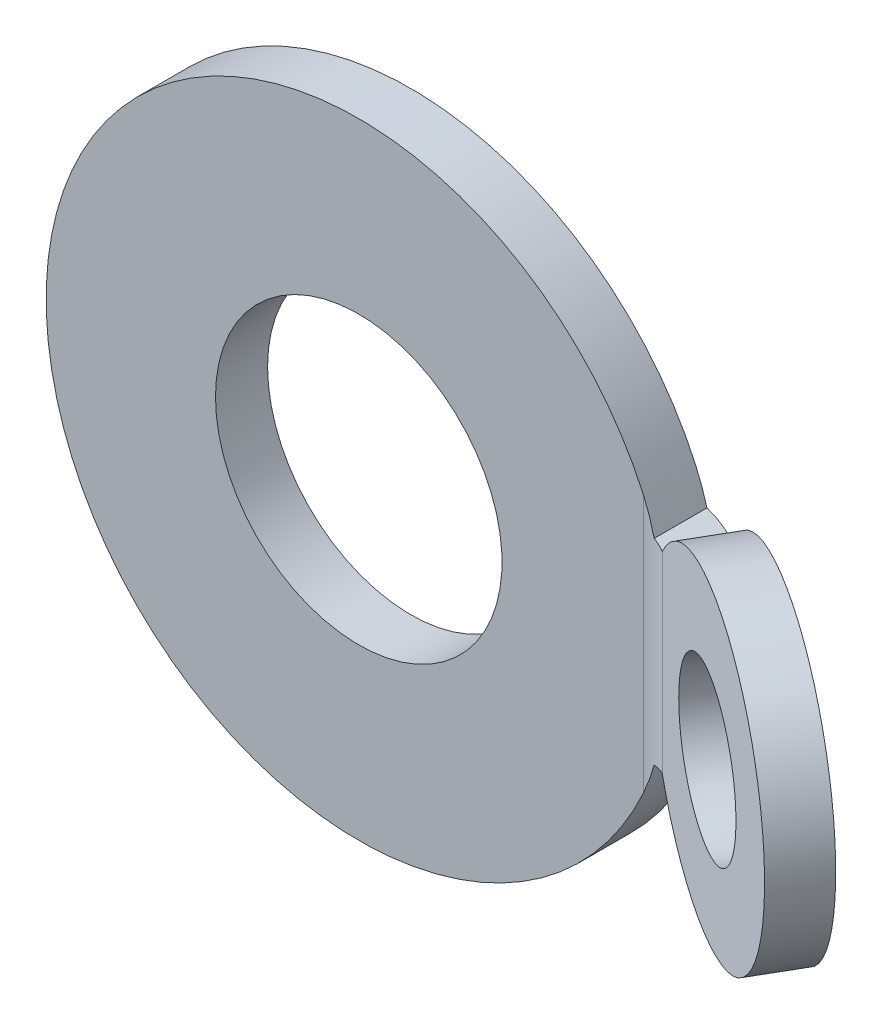
ISO-10303-21;
HEADER;
FILE_DESCRIPTION(('STEP AP214'),'2;1');
FILE_NAME('part.step','',(''),(''),'','','');
FILE_SCHEMA(('AUTOMOTIVE_DESIGN { 1 0 10303 214 1 1 1 1 }'));
ENDSEC;
DATA;
#1=APPLICATION_CONTEXT('core data for automotive mechanical design processes');
#2=APPLICATION_PROTOCOL_DEFINITION('international standard','automotive_design',2000,#1);
#3=PRODUCT_CONTEXT('',#1,'mechanical');
#4=PRODUCT('Part','Part','',(#3));
#5=PRODUCT_RELATED_PRODUCT_CATEGORY('part','',(#4));
#6=PRODUCT_DEFINITION_FORMATION('','',#4);
#7=PRODUCT_DEFINITION_CONTEXT('part definition',#1,'design');
#8=PRODUCT_DEFINITION('design','',#6,#7);
#9=PRODUCT_DEFINITION_SHAPE('','',#8);
#10=(LENGTH_UNIT() NAMED_UNIT(*) SI_UNIT(.MILLI.,.METRE.));
#11=(NAMED_UNIT(*) PLANE_ANGLE_UNIT() SI_UNIT($,.RADIAN.));
#12=(NAMED_UNIT(*) SI_UNIT($,.STERADIAN.) SOLID_ANGLE_UNIT());
#13=UNCERTAINTY_MEASURE_WITH_UNIT(LENGTH_MEASURE(1.E-05),#10,'distance_accuracy_value','');
#14=(GEOMETRIC_REPRESENTATION_CONTEXT(3) GLOBAL_UNCERTAINTY_ASSIGNED_CONTEXT((#13)) GLOBAL_UNIT_ASSIGNED_CONTEXT((#10,
#11,#12)) REPRESENTATION_CONTEXT('',''));
#15=CARTESIAN_POINT('',(0.,0.,0.));
#16=DIRECTION('',(0.,0.,1.));
#17=DIRECTION('',(1.,0.,0.));
#18=AXIS2_PLACEMENT_3D('',#15,#16,#17);
#19=CARTESIAN_POINT('',(-2.40192378864668,-6.,0.633974596215568));
#20=DIRECTION('',(-0.5,0.,0.866025403784439));
#21=DIRECTION('',(0.866025403784439,0.,0.5));
#22=AXIS2_PLACEMENT_3D('',#19,#20,#21);
#23=PLANE('',#22);
#24=DIRECTION('',(0.,-1.,0.));
#25=VECTOR('',#24,1.);
#26=CARTESIAN_POINT('',(-7.03589838486224,-6.,-2.04145188432737));
#27=LINE('',#26,#25);
#28=CARTESIAN_POINT('',(-7.03589838486224,1.86373022601282,-2.04145188432737));
#29=VERTEX_POINT('',#28);
#30=CARTESIAN_POINT('',(-7.03589838486224,-1.86373022601282,-2.04145188432737));
#31=VERTEX_POINT('',#30);
#32=EDGE_CURVE('E111',#29,#31,#27,.T.);
#33=ORIENTED_EDGE('',*,*,#32,.F.);
#34=CARTESIAN_POINT('',(-5.,0.,-0.866025403784431));
#35=DIRECTION('',(0.5,0.,-0.866025403784439));
#36=DIRECTION('',(-0.866025403784439,0.,-0.5));
#37=AXIS2_PLACEMENT_3D('',#34,#35,#36);
#38=CIRCLE('',#37,3.);
#39=EDGE_CURVE('E373',#31,#29,#38,.F.);
#40=ORIENTED_EDGE('',*,*,#39,.F.);
#41=EDGE_LOOP('',(#33,#40));
#42=FACE_BOUND('',#41,.T.);
#43=CARTESIAN_POINT('',(-5.,0.,-0.866025403784431));
#44=DIRECTION('',(0.5,0.,-0.866025403784439));
#45=DIRECTION('',(-0.866025403784439,0.,-0.5));
#46=AXIS2_PLACEMENT_3D('',#43,#44,#45);
#47=CIRCLE('',#46,1.5);
#48=CARTESIAN_POINT('',(-6.29903810567666,0.,-1.61602540378443));
#49=VERTEX_POINT('',#48);
#50=EDGE_CURVE('E20',#49,#49,#47,.F.);
#51=ORIENTED_EDGE('',*,*,#50,.T.);
#52=EDGE_LOOP('',(#51));
#53=FACE_BOUND('',#52,.T.);
#54=ADVANCED_FACE('F17',(#42,#53),#23,.F.);
#55=CARTESIAN_POINT('',(-5.25,0.,-0.433012701892215));
#56=DIRECTION('',(0.5,0.,-0.866025403784439));
#57=DIRECTION('',(-0.866025403784439,0.,-0.5));
#58=AXIS2_PLACEMENT_3D('',#55,#56,#57);
#59=CYLINDRICAL_SURFACE('',#58,1.5);
#60=ORIENTED_EDGE('',*,*,#50,.F.);
#61=EDGE_LOOP('',(#60));
#62=FACE_BOUND('',#61,.T.);
#63=CARTESIAN_POINT('',(-5.5,0.,0.));
#64=DIRECTION('',(0.5,0.,-0.866025403784439));
#65=DIRECTION('',(-0.866025403784439,0.,-0.5));
#66=AXIS2_PLACEMENT_3D('',#63,#64,#65);
#67=CIRCLE('',#66,1.5);
#68=CARTESIAN_POINT('',(-6.79903810567666,0.,-0.749999999999996));
#69=VERTEX_POINT('',#68);
#70=EDGE_CURVE('E89',#69,#69,#67,.F.);
#71=ORIENTED_EDGE('',*,*,#70,.T.);
#72=EDGE_LOOP('',(#71));
#73=FACE_BOUND('',#72,.T.);
#74=ADVANCED_FACE('F244',(#62,#73),#59,.F.);
#75=CARTESIAN_POINT('',(-5.25,0.,-0.433012701892213));
#76=DIRECTION('',(0.5,0.,-0.866025403784439));
#77=DIRECTION('',(-0.866025403784439,0.,-0.5));
#78=AXIS2_PLACEMENT_3D('',#75,#76,#77);
#79=CYLINDRICAL_SURFACE('',#78,3.);
#80=CARTESIAN_POINT('',(-7.55009449027577,1.84296335807702,-1.18346890936911));
#81=CARTESIAN_POINT('',(-7.54773069545789,1.84643638423818,-1.18215526106405));
#82=CARTESIAN_POINT('',(-7.54536578926449,1.84990346964674,-1.18082823450933));
#83=CARTESIAN_POINT('',(-7.54063375412665,1.85682575895867,-1.17814742490061));
#84=CARTESIAN_POINT('',(-7.53826662518221,1.86028096286203,-1.1767936418466));
#85=CARTESIAN_POINT('',(-7.53589838486225,1.8637302260128,-1.17542648054294));
#86=B_SPLINE_CURVE_WITH_KNOTS('',3,(#80,#81,#82,#83,#84,#85),.UNSPECIFIED.,.F.,.F.,(4,2,4),(0.,
0.0132049293105582,0.0264098586211165),.UNSPECIFIED.);
#87=CARTESIAN_POINT('',(-7.55009448063647,1.84296337224009,-1.18346890401152));
#88=VERTEX_POINT('',#87);
#89=CARTESIAN_POINT('',(-7.53589838486225,1.8637302260128,-1.17542648054294));
#90=VERTEX_POINT('',#89);
#91=EDGE_CURVE('E84',#88,#90,#86,.T.);
#92=ORIENTED_EDGE('',*,*,#91,.T.);
#93=CARTESIAN_POINT('',(-5.5,0.,0.));
#94=DIRECTION('',(0.5,0.,-0.866025403784439));
#95=DIRECTION('',(-0.866025403784439,0.,-0.5));
#96=AXIS2_PLACEMENT_3D('',#93,#94,#95);
#97=CIRCLE('',#96,3.);
#98=CARTESIAN_POINT('',(-7.53589838486225,-1.8637302260128,-1.17542648054294));
#99=VERTEX_POINT('',#98);
#100=EDGE_CURVE('E78',#90,#99,#97,.T.);
#101=ORIENTED_EDGE('',*,*,#100,.T.);
#102=CARTESIAN_POINT('',(-7.53589838486225,-1.8637302260128,-1.17542648054294));
#103=CARTESIAN_POINT('',(-7.53826660492245,-1.86028099236818,-1.17679363015328));
#104=CARTESIAN_POINT('',(-7.54063371362737,-1.85682581807195,-1.17814740174173));
#105=CARTESIAN_POINT('',(-7.54536570832667,-1.84990358817625,-1.18082818887484));
#106=CARTESIAN_POINT('',(-7.54773059432104,-1.84643653257678,-1.18215520441951));
#107=CARTESIAN_POINT('',(-7.55009436896013,-1.84296353632569,-1.18346884194228));
#108=B_SPLINE_CURVE_WITH_KNOTS('',3,(#102,#103,#104,#105,#106,#107),.UNSPECIFIED.,.F.,.F.,(4,2,
4),(0.,0.0132048163549418,0.0264096327098835),.UNSPECIFIED.);
#109=CARTESIAN_POINT('',(-7.55009441997897,-1.84296346136447,-1.18346887029746));
#110=VERTEX_POINT('',#109);
#111=EDGE_CURVE('E81',#99,#110,#108,.T.);
#112=ORIENTED_EDGE('',*,*,#111,.T.);
#113=CARTESIAN_POINT('',(4.09999999999982,0.,-16.6276877526609));
#114=DIRECTION('',(0.156250000000002,-0.987717539329944,0.));
#115=DIRECTION('',(0.489288443988219,0.0774020064734538,-0.868680463676645));
#116=AXIS2_PLACEMENT_3D('',#113,#114,#115);
#117=ELLIPSE('',#116,38.3999999999995,3.);
#118=CARTESIAN_POINT('',(-7.09745387695325,-1.77135881322999,-2.07556115030958));
#119=VERTEX_POINT('',#118);
#120=EDGE_CURVE('E98',#110,#119,#117,.T.);
#121=ORIENTED_EDGE('',*,*,#120,.T.);
#122=CARTESIAN_POINT('',(-7.03589838486224,-1.86373022601282,-2.04145188432737));
#123=CARTESIAN_POINT('',(-7.04631624777204,-1.84856026412287,-2.04746057701613));
#124=CARTESIAN_POINT('',(-7.05665479809041,-1.83327766585455,-2.05330737108177));
#125=CARTESIAN_POINT('',(-7.07717327354666,-1.80248719655766,-2.06467716196811));
#126=CARTESIAN_POINT('',(-7.08735319868449,-1.78697932552903,-2.07020015878873));
#127=CARTESIAN_POINT('',(-7.09745381123086,-1.77135881812198,-2.07556125698616));
#128=B_SPLINE_CURVE_WITH_KNOTS('',3,(#122,#123,#124,#125,#126,#127),.UNSPECIFIED.,.F.,.F.,(4,2,
4),(0.,0.0580659616321142,0.116131923277448),.UNSPECIFIED.);
#129=EDGE_CURVE('E114',#31,#119,#128,.T.);
#130=ORIENTED_EDGE('',*,*,#129,.F.);
#131=ORIENTED_EDGE('',*,*,#39,.T.);
#132=CARTESIAN_POINT('',(-7.09745381629485,1.77135881028857,-2.0755612596769));
#133=CARTESIAN_POINT('',(-7.08735320293204,1.78697931903824,-2.07020016108423));
#134=CARTESIAN_POINT('',(-7.077173276964,1.80248719139096,-2.06467716384177));
#135=CARTESIAN_POINT('',(-7.05665479981976,1.83327766329899,-2.05330737205852));
#136=CARTESIAN_POINT('',(-7.0463162486436,1.84856026285436,-2.04746057751781));
#137=CARTESIAN_POINT('',(-7.03589838486224,1.86373022601282,-2.04145188432737));
#138=B_SPLINE_CURVE_WITH_KNOTS('',3,(#132,#133,#134,#135,#136,#137),.UNSPECIFIED.,.F.,.F.,(4,2,
4),(0.,0.0580659664990685,0.116131932984917),.UNSPECIFIED.);
#139=CARTESIAN_POINT('',(-7.09745381824617,1.7713588072701,-2.07556126071373));
#140=VERTEX_POINT('',#139);
#141=EDGE_CURVE('E115',#140,#29,#138,.T.);
#142=ORIENTED_EDGE('',*,*,#141,.F.);
#143=CARTESIAN_POINT('',(4.09999999999991,0.,-16.6276877526611));
#144=DIRECTION('',(0.156250000000001,0.987717539329944,0.));
#145=DIRECTION('',(0.489288443988219,-0.0774020064734533,-0.868680463676645));
#146=AXIS2_PLACEMENT_3D('',#143,#144,#145);
#147=ELLIPSE('',#146,38.3999999999998,3.);
#148=EDGE_CURVE('E163',#88,#140,#147,.F.);
#149=ORIENTED_EDGE('',*,*,#148,.F.);
#150=EDGE_LOOP('',(#92,#101,#112,#121,#130,#131,#142,#149));
#151=FACE_BOUND('',#150,.T.);
#152=ADVANCED_FACE('F80',(#151),#79,.T.);
#153=CARTESIAN_POINT('',(-8.03589838486222,-6.,-0.309401076758565));
#154=DIRECTION('',(0.,-1.,0.));
#155=DIRECTION('',(0.,0.,-1.));
#156=AXIS2_PLACEMENT_3D('',#153,#154,#155);
#157=CYLINDRICAL_SURFACE('',#156,1.99999999999993);
#158=CARTESIAN_POINT('',(-7.80312870809979,-1.882991631294,-2.29580946316344));
#159=CARTESIAN_POINT('',(-7.8198610203626,-1.93361465994927,-2.29776911619673));
#160=CARTESIAN_POINT('',(-7.83727015056641,-1.98401989266842,-2.29959587526771));
#161=CARTESIAN_POINT('',(-7.87341556250552,-2.0843191951558,-2.30287278085647));
#162=CARTESIAN_POINT('',(-7.89215077944476,-2.13421363902998,-2.30432322527019));
#163=CARTESIAN_POINT('',(-7.93094868208817,-2.23349678557603,-2.30674014827004));
#164=CARTESIAN_POINT('',(-7.95101138077769,-2.28288548329524,-2.3077066221212));
#165=CARTESIAN_POINT('',(-7.99246508273286,-2.3811564644323,-2.30903673875208));
#166=CARTESIAN_POINT('',(-8.01385712906735,-2.43003831415012,-2.30939990178828));
#167=CARTESIAN_POINT('',(-8.03589838486224,-2.47862734985493,-2.3094010767585));
#168=B_SPLINE_CURVE_WITH_KNOTS('',3,(#158,#159,#160,#161,#162,#163,#164,#165,#166,#167),
.UNSPECIFIED.,.F.,.F.,(4,2,2,2,4),(0.,0.160054013681955,0.319980937104648,0.479909425155692,
0.639965025123513),.UNSPECIFIED.);
#169=CARTESIAN_POINT('',(-7.80312870809979,-1.882991631294,-2.29580946316345));
#170=VERTEX_POINT('',#169);
#171=CARTESIAN_POINT('',(-8.03589838486224,-2.47862734985493,-2.3094010767585));
#172=VERTEX_POINT('',#171);
#173=EDGE_CURVE('E164',#170,#172,#168,.T.);
#174=ORIENTED_EDGE('',*,*,#173,.T.);
#175=DIRECTION('',(0.,1.,0.));
#176=VECTOR('',#175,1.);
#177=CARTESIAN_POINT('',(-8.03589838486224,-6.,-2.3094010767585));
#178=LINE('',#177,#176);
#179=CARTESIAN_POINT('',(-8.03589838486224,2.47862734985494,-2.3094010767585));
#180=VERTEX_POINT('',#179);
#181=EDGE_CURVE('E88',#172,#180,#178,.T.);
#182=ORIENTED_EDGE('',*,*,#181,.T.);
#183=CARTESIAN_POINT('',(-8.03589838486224,2.47862734985494,-2.3094010767585));
#184=CARTESIAN_POINT('',(-8.01385712906735,2.43003831415013,-2.30939990178828));
#185=CARTESIAN_POINT('',(-7.99246508273286,2.38115646443231,-2.30903673875208));
#186=CARTESIAN_POINT('',(-7.95101138077769,2.28288548329525,-2.3077066221212));
#187=CARTESIAN_POINT('',(-7.93094868208817,2.23349678557603,-2.30674014827004));
#188=CARTESIAN_POINT('',(-7.89215077944476,2.13421363902999,-2.30432322527019));
#189=CARTESIAN_POINT('',(-7.87341556250552,2.0843191951558,-2.30287278085647));
#190=CARTESIAN_POINT('',(-7.83727015056641,1.98401989266843,-2.29959587526771));
#191=CARTESIAN_POINT('',(-7.8198610203626,1.93361465994927,-2.29776911619673));
#192=CARTESIAN_POINT('',(-7.80312870809979,1.882991631294,-2.29580946316344));
#193=B_SPLINE_CURVE_WITH_KNOTS('',3,(#183,#184,#185,#186,#187,#188,#189,#190,#191,#192),
.UNSPECIFIED.,.F.,.F.,(4,2,2,2,4),(0.,0.160055599967823,0.31998408801887,0.479911011441565,
0.639965025123522),.UNSPECIFIED.);
#194=CARTESIAN_POINT('',(-7.80312870809979,1.882991631294,-2.29580946316344));
#195=VERTEX_POINT('',#194);
#196=EDGE_CURVE('E141',#180,#195,#193,.T.);
#197=ORIENTED_EDGE('',*,*,#196,.T.);
#198=CARTESIAN_POINT('',(-8.03589838486222,1.9198141646053,-0.309401076758565));
#199=DIRECTION('',(0.156250000000001,0.987717539329944,0.));
#200=DIRECTION('',(0.987717539329944,-0.156250000000001,0.));
#201=AXIS2_PLACEMENT_3D('',#198,#199,#200);
#202=ELLIPSE('',#201,2.02487039093859,1.99999999999993);
#203=EDGE_CURVE('E160',#140,#195,#202,.T.);
#204=ORIENTED_EDGE('',*,*,#203,.F.);
#205=ORIENTED_EDGE('',*,*,#141,.T.);
#206=ORIENTED_EDGE('',*,*,#32,.T.);
#207=ORIENTED_EDGE('',*,*,#129,.T.);
#208=CARTESIAN_POINT('',(-8.03589838486222,-1.9198141646053,-0.309401076758565));
#209=DIRECTION('',(0.156250000000002,-0.987717539329944,0.));
#210=DIRECTION('',(-0.987717539329944,-0.156250000000002,0.));
#211=AXIS2_PLACEMENT_3D('',#208,#209,#210);
#212=ELLIPSE('',#211,2.02487039093859,1.99999999999993);
#213=EDGE_CURVE('E169',#119,#170,#212,.F.);
#214=ORIENTED_EDGE('',*,*,#213,.T.);
#215=EDGE_LOOP('',(#174,#182,#197,#204,#205,#206,#207,#214));
#216=FACE_BOUND('',#215,.T.);
#217=ADVANCED_FACE('F171',(#216),#157,.T.);
#218=CARTESIAN_POINT('',(-9.,2.07232829072629,-2.3094010767585));
#219=DIRECTION('',(0.156250000000001,0.987717539329944,0.));
#220=DIRECTION('',(-0.987717539329944,0.156250000000001,0.));
#221=AXIS2_PLACEMENT_3D('',#218,#219,#220);
#222=PLANE('',#221);
#223=ORIENTED_EDGE('',*,*,#203,.T.);
#224=DIRECTION('',(0.,0.,-1.));
#225=VECTOR('',#224,1.);
#226=CARTESIAN_POINT('',(-7.80312870809979,1.882991631294,-1.8094010767585));
#227=LINE('',#226,#225);
#228=CARTESIAN_POINT('',(-7.80312870809979,1.882991631294,-1.28193296702221));
#229=VERTEX_POINT('',#228);
#230=EDGE_CURVE('E154',#229,#195,#227,.T.);
#231=ORIENTED_EDGE('',*,*,#230,.F.);
#232=CARTESIAN_POINT('',(-8.03589838486224,1.9198141646053,-0.309401076758493));
#233=DIRECTION('',(0.156250000000001,0.987717539329944,0.));
#234=DIRECTION('',(0.987717539329944,-0.156250000000001,0.));
#235=AXIS2_PLACEMENT_3D('',#232,#233,#234);
#236=ELLIPSE('',#235,1.01243519546933,1.);
#237=EDGE_CURVE('E101',#229,#88,#236,.F.);
#238=ORIENTED_EDGE('',*,*,#237,.T.);
#239=ORIENTED_EDGE('',*,*,#148,.T.);
#240=EDGE_LOOP('',(#223,#231,#238,#239));
#241=FACE_BOUND('',#240,.T.);
#242=ADVANCED_FACE('F176',(#241),#222,.T.);
#243=CARTESIAN_POINT('',(-7.53589838486225,-6.,-1.17542648054294));
#244=DIRECTION('',(0.5,0.,-0.866025403784439));
#245=DIRECTION('',(-0.866025403784439,0.,-0.5));
#246=AXIS2_PLACEMENT_3D('',#243,#244,#245);
#247=PLANE('',#246);
#248=DIRECTION('',(0.,-1.,0.));
#249=VECTOR('',#248,1.);
#250=CARTESIAN_POINT('',(-7.53589838486225,-6.,-1.17542648054294));
#251=LINE('',#250,#249);
#252=EDGE_CURVE('E93',#90,#99,#251,.T.);
#253=ORIENTED_EDGE('',*,*,#252,.T.);
#254=ORIENTED_EDGE('',*,*,#100,.F.);
#255=EDGE_LOOP('',(#253,#254));
#256=FACE_BOUND('',#255,.T.);
#257=ORIENTED_EDGE('',*,*,#70,.F.);
#258=EDGE_LOOP('',(#257));
#259=FACE_BOUND('',#258,.T.);
#260=ADVANCED_FACE('F99',(#256,#259),#247,.F.);
#261=CARTESIAN_POINT('',(-8.03589838486224,-6.,-2.3094010767585));
#262=DIRECTION('',(0.,0.,1.));
#263=DIRECTION('',(1.,0.,0.));
#264=AXIS2_PLACEMENT_3D('',#261,#262,#263);
#265=PLANE('',#264);
#266=ORIENTED_EDGE('',*,*,#181,.F.);
#267=CARTESIAN_POINT('',(-13.5,0.,-2.3094010767585));
#268=DIRECTION('',(0.,0.,-1.));
#269=DIRECTION('',(-1.,0.,0.));
#270=AXIS2_PLACEMENT_3D('',#267,#268,#269);
#271=CIRCLE('',#270,6.);
#272=EDGE_CURVE('E103',#180,#172,#271,.F.);
#273=ORIENTED_EDGE('',*,*,#272,.F.);
#274=EDGE_LOOP('',(#266,#273));
#275=FACE_BOUND('',#274,.T.);
#276=CARTESIAN_POINT('',(-13.5,0.,-2.3094010767585));
#277=DIRECTION('',(0.,0.,-1.));
#278=DIRECTION('',(-1.,0.,0.));
#279=AXIS2_PLACEMENT_3D('',#276,#277,#278);
#280=CIRCLE('',#279,2.75);
#281=CARTESIAN_POINT('',(-16.25,0.,-2.3094010767585));
#282=VERTEX_POINT('',#281);
#283=EDGE_CURVE('E155',#282,#282,#280,.F.);
#284=ORIENTED_EDGE('',*,*,#283,.T.);
#285=EDGE_LOOP('',(#284));
#286=FACE_BOUND('',#285,.T.);
#287=ADVANCED_FACE('F203',(#275,#286),#265,.F.);
#288=CARTESIAN_POINT('',(-5.5,-1.51865279320399,-2.3094010767585));
#289=DIRECTION('',(0.156250000000002,-0.987717539329944,0.));
#290=DIRECTION('',(0.987717539329944,0.156250000000002,0.));
#291=AXIS2_PLACEMENT_3D('',#288,#289,#290);
#292=PLANE('',#291);
#293=ORIENTED_EDGE('',*,*,#213,.F.);
#294=ORIENTED_EDGE('',*,*,#120,.F.);
#295=CARTESIAN_POINT('',(-8.03589838486224,-1.9198141646053,-0.309401076758493));
#296=DIRECTION('',(0.156250000000002,-0.987717539329944,0.));
#297=DIRECTION('',(-0.987717539329944,-0.156250000000002,0.));
#298=AXIS2_PLACEMENT_3D('',#295,#296,#297);
#299=ELLIPSE('',#298,1.01243519546933,1.);
#300=CARTESIAN_POINT('',(-7.80312870809979,-1.882991631294,-1.28193296702221));
#301=VERTEX_POINT('',#300);
#302=EDGE_CURVE('E96',#110,#301,#299,.F.);
#303=ORIENTED_EDGE('',*,*,#302,.T.);
#304=DIRECTION('',(0.,0.,-1.));
#305=VECTOR('',#304,1.);
#306=CARTESIAN_POINT('',(-7.80312870809979,-1.882991631294,-1.8094010767585));
#307=LINE('',#306,#305);
#308=EDGE_CURVE('E127',#170,#301,#307,.F.);
#309=ORIENTED_EDGE('',*,*,#308,.F.);
#310=EDGE_LOOP('',(#293,#294,#303,#309));
#311=FACE_BOUND('',#310,.T.);
#312=ADVANCED_FACE('F197',(#311),#292,.T.);
#313=CARTESIAN_POINT('',(-13.5,0.,-1.8094010767585));
#314=DIRECTION('',(0.,0.,-1.));
#315=DIRECTION('',(-1.,0.,0.));
#316=AXIS2_PLACEMENT_3D('',#313,#314,#315);
#317=CYLINDRICAL_SURFACE('',#316,2.75);
#318=ORIENTED_EDGE('',*,*,#283,.F.);
#319=EDGE_LOOP('',(#318));
#320=FACE_BOUND('',#319,.T.);
#321=CARTESIAN_POINT('',(-13.5,0.,-1.3094010767585));
#322=DIRECTION('',(0.,0.,-1.));
#323=DIRECTION('',(-1.,0.,0.));
#324=AXIS2_PLACEMENT_3D('',#321,#322,#323);
#325=CIRCLE('',#324,2.75);
#326=CARTESIAN_POINT('',(-16.25,0.,-1.3094010767585));
#327=VERTEX_POINT('',#326);
#328=EDGE_CURVE('E117',#327,#327,#325,.F.);
#329=ORIENTED_EDGE('',*,*,#328,.T.);
#330=EDGE_LOOP('',(#329));
#331=FACE_BOUND('',#330,.T.);
#332=ADVANCED_FACE('F214',(#320,#331),#317,.F.);
#333=CARTESIAN_POINT('',(-8.03589838486224,-6.,-0.309401076758493));
#334=DIRECTION('',(0.,-1.,0.));
#335=DIRECTION('',(0.,0.,-1.));
#336=AXIS2_PLACEMENT_3D('',#333,#334,#335);
#337=CYLINDRICAL_SURFACE('',#336,1.);
#338=ORIENTED_EDGE('',*,*,#302,.F.);
#339=ORIENTED_EDGE('',*,*,#111,.F.);
#340=ORIENTED_EDGE('',*,*,#252,.F.);
#341=ORIENTED_EDGE('',*,*,#91,.F.);
#342=ORIENTED_EDGE('',*,*,#237,.F.);
#343=CARTESIAN_POINT('',(-8.03589838486224,2.47862734985495,-1.30940107675849));
#344=CARTESIAN_POINT('',(-8.01383328848085,2.42998643320347,-1.30939748433561));
#345=CARTESIAN_POINT('',(-7.99242108067409,2.3810558192817,-1.30867098001963));
#346=CARTESIAN_POINT('',(-7.95094313991121,2.28272003817196,-1.30600318285767));
#347=CARTESIAN_POINT('',(-7.93087600551922,2.23331542820287,-1.30406317685037));
#348=CARTESIAN_POINT('',(-7.89208284519839,2.13403515850437,-1.29919852276867));
#349=CARTESIAN_POINT('',(-7.87335676870851,2.08415951661432,-1.2962739118399));
#350=CARTESIAN_POINT('',(-7.83723535532464,1.98391985991535,-1.28964064373333));
#351=CARTESIAN_POINT('',(-7.81984144884699,1.93355538380881,-1.28593115943838));
#352=CARTESIAN_POINT('',(-7.80312870809979,1.882991631294,-1.2819329670222));
#353=B_SPLINE_CURVE_WITH_KNOTS('',3,(#343,#344,#345,#346,#347,#348,#349,#350,#351,#352),
.UNSPECIFIED.,.F.,.F.,(4,2,2,2,4),(0.,0.160217052913445,0.320264493546612,0.48030589683559,
0.640516802911825),.UNSPECIFIED.);
#354=CARTESIAN_POINT('',(-8.03589838486225,2.47862734985496,-1.3094010767585));
#355=VERTEX_POINT('',#354);
#356=EDGE_CURVE('E106',#355,#229,#353,.T.);
#357=ORIENTED_EDGE('',*,*,#356,.F.);
#358=DIRECTION('',(0.,1.,0.));
#359=VECTOR('',#358,1.);
#360=CARTESIAN_POINT('',(-8.03589838486225,-6.,-1.3094010767585));
#361=LINE('',#360,#359);
#362=CARTESIAN_POINT('',(-8.03589838486225,-2.47862734985496,-1.3094010767585));
#363=VERTEX_POINT('',#362);
#364=EDGE_CURVE('E11',#355,#363,#361,.F.);
#365=ORIENTED_EDGE('',*,*,#364,.T.);
#366=CARTESIAN_POINT('',(-7.80312870809979,-1.882991631294,-1.2819329670222));
#367=CARTESIAN_POINT('',(-7.81984144884699,-1.93355538380881,-1.28593115943838));
#368=CARTESIAN_POINT('',(-7.83723535532464,-1.98391985991535,-1.28964064373333));
#369=CARTESIAN_POINT('',(-7.87335676870851,-2.08415951661431,-1.2962739118399));
#370=CARTESIAN_POINT('',(-7.89208284519839,-2.13403515850437,-1.29919852276867));
#371=CARTESIAN_POINT('',(-7.93087600551922,-2.23331542820287,-1.30406317685037));
#372=CARTESIAN_POINT('',(-7.95094313991121,-2.28272003817196,-1.30600318285767));
#373=CARTESIAN_POINT('',(-7.99242108067409,-2.3810558192817,-1.30867098001963));
#374=CARTESIAN_POINT('',(-8.01383328848085,-2.42998643320347,-1.30939748433561));
#375=CARTESIAN_POINT('',(-8.03589838486225,-2.47862734985495,-1.30940107675849));
#376=B_SPLINE_CURVE_WITH_KNOTS('',3,(#366,#367,#368,#369,#370,#371,#372,#373,#374,#375),
.UNSPECIFIED.,.F.,.F.,(4,2,2,2,4),(0.,0.160210906076236,0.320252309365213,0.480299749998382,
0.640516802911828),.UNSPECIFIED.);
#377=EDGE_CURVE('E120',#301,#363,#376,.T.);
#378=ORIENTED_EDGE('',*,*,#377,.F.);
#379=EDGE_LOOP('',(#338,#339,#340,#341,#342,#357,#365,#378));
#380=FACE_BOUND('',#379,.T.);
#381=ADVANCED_FACE('F92',(#380),#337,.F.);
#382=CARTESIAN_POINT('',(-13.5,0.,-1.8094010767585));
#383=DIRECTION('',(0.,0.,-1.));
#384=DIRECTION('',(-1.,0.,0.));
#385=AXIS2_PLACEMENT_3D('',#382,#383,#384);
#386=CYLINDRICAL_SURFACE('',#385,6.);
#387=ORIENTED_EDGE('',*,*,#377,.T.);
#388=CARTESIAN_POINT('',(-13.5,0.,-1.3094010767585));
#389=DIRECTION('',(0.,0.,-1.));
#390=DIRECTION('',(-1.,0.,0.));
#391=AXIS2_PLACEMENT_3D('',#388,#389,#390);
#392=CIRCLE('',#391,6.);
#393=EDGE_CURVE('E26',#363,#355,#392,.T.);
#394=ORIENTED_EDGE('',*,*,#393,.T.);
#395=ORIENTED_EDGE('',*,*,#356,.T.);
#396=ORIENTED_EDGE('',*,*,#230,.T.);
#397=ORIENTED_EDGE('',*,*,#196,.F.);
#398=ORIENTED_EDGE('',*,*,#272,.T.);
#399=ORIENTED_EDGE('',*,*,#173,.F.);
#400=ORIENTED_EDGE('',*,*,#308,.T.);
#401=EDGE_LOOP('',(#387,#394,#395,#396,#397,#398,#399,#400));
#402=FACE_BOUND('',#401,.T.);
#403=ADVANCED_FACE('F130',(#402),#386,.T.);
#404=CARTESIAN_POINT('',(-19.5,-6.,-1.3094010767585));
#405=DIRECTION('',(0.,0.,-1.));
#406=DIRECTION('',(-1.,0.,0.));
#407=AXIS2_PLACEMENT_3D('',#404,#405,#406);
#408=PLANE('',#407);
#409=ORIENTED_EDGE('',*,*,#364,.F.);
#410=ORIENTED_EDGE('',*,*,#393,.F.);
#411=EDGE_LOOP('',(#409,#410));
#412=FACE_BOUND('',#411,.T.);
#413=ORIENTED_EDGE('',*,*,#328,.F.);
#414=EDGE_LOOP('',(#413));
#415=FACE_BOUND('',#414,.T.);
#416=ADVANCED_FACE('F134',(#412,#415),#408,.F.);
#417=CLOSED_SHELL('',(#54,#74,#152,#217,#242,#260,#287,#312,#332,#381,#403,#416));
#418=MANIFOLD_SOLID_BREP('B1',#417);
#419=ADVANCED_BREP_SHAPE_REPRESENTATION('',(#18,#418),#14);
#420=SHAPE_DEFINITION_REPRESENTATION(#9,#419);
ENDSEC;
END-ISO-10303-21;
